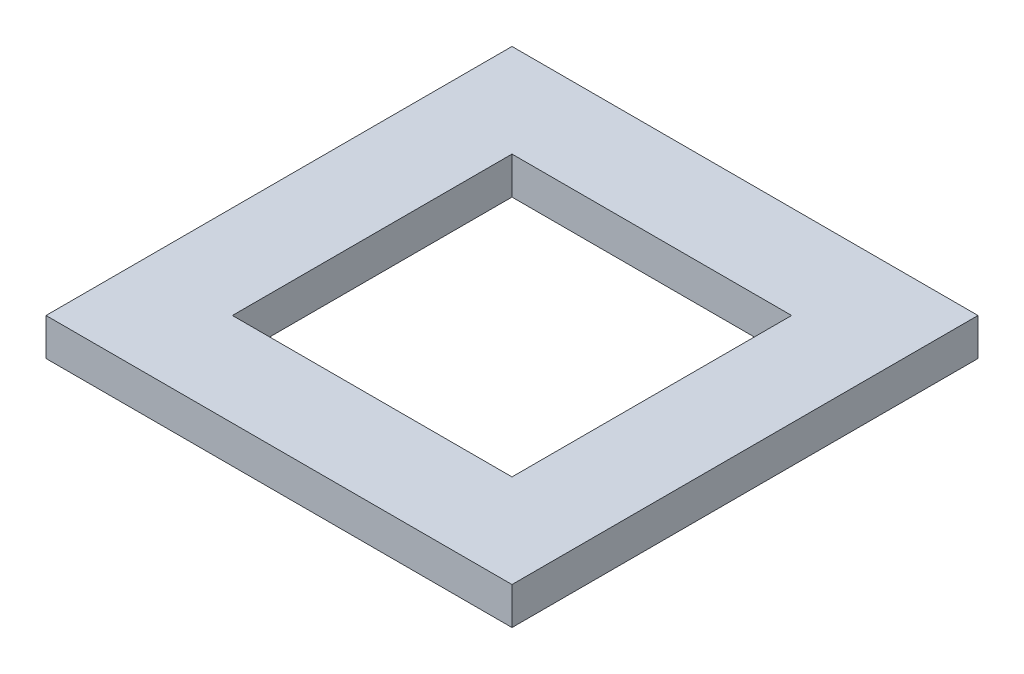
ISO-10303-21;
HEADER;
FILE_DESCRIPTION(('STEP AP214'),'2;1');
FILE_NAME('part.step','',(''),(''),'','','');
FILE_SCHEMA(('AUTOMOTIVE_DESIGN { 1 0 10303 214 1 1 1 1 }'));
ENDSEC;
DATA;
#1=APPLICATION_CONTEXT('core data for automotive mechanical design processes');
#2=APPLICATION_PROTOCOL_DEFINITION('international standard','automotive_design',2000,#1);
#3=PRODUCT_CONTEXT('',#1,'mechanical');
#4=PRODUCT('Part','Part','',(#3));
#5=PRODUCT_RELATED_PRODUCT_CATEGORY('part','',(#4));
#6=PRODUCT_DEFINITION_FORMATION('','',#4);
#7=PRODUCT_DEFINITION_CONTEXT('part definition',#1,'design');
#8=PRODUCT_DEFINITION('design','',#6,#7);
#9=PRODUCT_DEFINITION_SHAPE('','',#8);
#10=(LENGTH_UNIT() NAMED_UNIT(*) SI_UNIT(.MILLI.,.METRE.));
#11=(NAMED_UNIT(*) PLANE_ANGLE_UNIT() SI_UNIT($,.RADIAN.));
#12=(NAMED_UNIT(*) SI_UNIT($,.STERADIAN.) SOLID_ANGLE_UNIT());
#13=UNCERTAINTY_MEASURE_WITH_UNIT(LENGTH_MEASURE(1.E-05),#10,'distance_accuracy_value','');
#14=(GEOMETRIC_REPRESENTATION_CONTEXT(3) GLOBAL_UNCERTAINTY_ASSIGNED_CONTEXT((#13)) GLOBAL_UNIT_ASSIGNED_CONTEXT((#10,
#11,#12)) REPRESENTATION_CONTEXT('',''));
#15=CARTESIAN_POINT('',(0.,0.,0.));
#16=DIRECTION('',(0.,0.,1.));
#17=DIRECTION('',(1.,0.,0.));
#18=AXIS2_PLACEMENT_3D('',#15,#16,#17);
#19=CARTESIAN_POINT('',(0.,2.,0.));
#20=DIRECTION('',(0.,1.,0.));
#21=DIRECTION('',(0.,0.,1.));
#22=AXIS2_PLACEMENT_3D('',#19,#20,#21);
#23=PLANE('',#22);
#24=DIRECTION('',(1.,0.,0.));
#25=VECTOR('',#24,1.);
#26=CARTESIAN_POINT('',(-12.5,2.,12.5));
#27=LINE('',#26,#25);
#28=CARTESIAN_POINT('',(-12.5,2.,12.5));
#29=VERTEX_POINT('',#28);
#30=CARTESIAN_POINT('',(12.5,2.,12.5));
#31=VERTEX_POINT('',#30);
#32=EDGE_CURVE('E153',#29,#31,#27,.T.);
#33=ORIENTED_EDGE('',*,*,#32,.T.);
#34=DIRECTION('',(0.,0.,-1.));
#35=VECTOR('',#34,1.);
#36=CARTESIAN_POINT('',(12.5,2.,12.5));
#37=LINE('',#36,#35);
#38=CARTESIAN_POINT('',(12.5,2.,-12.5));
#39=VERTEX_POINT('',#38);
#40=EDGE_CURVE('E157',#31,#39,#37,.T.);
#41=ORIENTED_EDGE('',*,*,#40,.T.);
#42=DIRECTION('',(-1.,0.,0.));
#43=VECTOR('',#42,1.);
#44=CARTESIAN_POINT('',(-12.5,2.,-12.5));
#45=LINE('',#44,#43);
#46=CARTESIAN_POINT('',(-12.5,2.,-12.5));
#47=VERTEX_POINT('',#46);
#48=EDGE_CURVE('E161',#39,#47,#45,.T.);
#49=ORIENTED_EDGE('',*,*,#48,.T.);
#50=DIRECTION('',(0.,0.,1.));
#51=VECTOR('',#50,1.);
#52=CARTESIAN_POINT('',(-12.5,2.,12.5));
#53=LINE('',#52,#51);
#54=EDGE_CURVE('E164',#47,#29,#53,.T.);
#55=ORIENTED_EDGE('',*,*,#54,.T.);
#56=EDGE_LOOP('',(#33,#41,#49,#55));
#57=FACE_BOUND('',#56,.T.);
#58=DIRECTION('',(0.,0.,-1.));
#59=VECTOR('',#58,1.);
#60=CARTESIAN_POINT('',(7.5,2.,7.5));
#61=LINE('',#60,#59);
#62=CARTESIAN_POINT('',(7.5,2.,7.5));
#63=VERTEX_POINT('',#62);
#64=CARTESIAN_POINT('',(7.5,2.,-7.5));
#65=VERTEX_POINT('',#64);
#66=EDGE_CURVE('E114',#63,#65,#61,.T.);
#67=ORIENTED_EDGE('',*,*,#66,.F.);
#68=DIRECTION('',(1.,0.,0.));
#69=VECTOR('',#68,1.);
#70=CARTESIAN_POINT('',(-7.5,2.,7.5));
#71=LINE('',#70,#69);
#72=CARTESIAN_POINT('',(-7.5,2.,7.5));
#73=VERTEX_POINT('',#72);
#74=EDGE_CURVE('E105',#73,#63,#71,.T.);
#75=ORIENTED_EDGE('',*,*,#74,.F.);
#76=DIRECTION('',(0.,0.,1.));
#77=VECTOR('',#76,1.);
#78=CARTESIAN_POINT('',(-7.5,2.,7.5));
#79=LINE('',#78,#77);
#80=CARTESIAN_POINT('',(-7.5,2.,-7.5));
#81=VERTEX_POINT('',#80);
#82=EDGE_CURVE('E131',#81,#73,#79,.T.);
#83=ORIENTED_EDGE('',*,*,#82,.F.);
#84=DIRECTION('',(-1.,0.,0.));
#85=VECTOR('',#84,1.);
#86=CARTESIAN_POINT('',(-7.5,2.,-7.5));
#87=LINE('',#86,#85);
#88=EDGE_CURVE('E127',#65,#81,#87,.T.);
#89=ORIENTED_EDGE('',*,*,#88,.F.);
#90=EDGE_LOOP('',(#67,#75,#83,#89));
#91=FACE_BOUND('',#90,.T.);
#92=ADVANCED_FACE('F39',(#57,#91),#23,.T.);
#93=CARTESIAN_POINT('',(0.,0.,0.));
#94=DIRECTION('',(0.,1.,0.));
#95=DIRECTION('',(0.,0.,1.));
#96=AXIS2_PLACEMENT_3D('',#93,#94,#95);
#97=PLANE('',#96);
#98=DIRECTION('',(1.,0.,0.));
#99=VECTOR('',#98,1.);
#100=CARTESIAN_POINT('',(-12.5,0.,12.5));
#101=LINE('',#100,#99);
#102=CARTESIAN_POINT('',(-12.5,0.,12.5));
#103=VERTEX_POINT('',#102);
#104=CARTESIAN_POINT('',(12.5,0.,12.5));
#105=VERTEX_POINT('',#104);
#106=EDGE_CURVE('E123',#103,#105,#101,.T.);
#107=ORIENTED_EDGE('',*,*,#106,.F.);
#108=DIRECTION('',(0.,0.,1.));
#109=VECTOR('',#108,1.);
#110=CARTESIAN_POINT('',(-12.5,0.,12.5));
#111=LINE('',#110,#109);
#112=CARTESIAN_POINT('',(-12.5,0.,-12.5));
#113=VERTEX_POINT('',#112);
#114=EDGE_CURVE('E158',#113,#103,#111,.T.);
#115=ORIENTED_EDGE('',*,*,#114,.F.);
#116=DIRECTION('',(-1.,0.,0.));
#117=VECTOR('',#116,1.);
#118=CARTESIAN_POINT('',(-12.5,0.,-12.5));
#119=LINE('',#118,#117);
#120=CARTESIAN_POINT('',(12.5,0.,-12.5));
#121=VERTEX_POINT('',#120);
#122=EDGE_CURVE('E174',#121,#113,#119,.T.);
#123=ORIENTED_EDGE('',*,*,#122,.F.);
#124=DIRECTION('',(0.,0.,-1.));
#125=VECTOR('',#124,1.);
#126=CARTESIAN_POINT('',(12.5,0.,12.5));
#127=LINE('',#126,#125);
#128=EDGE_CURVE('E171',#105,#121,#127,.T.);
#129=ORIENTED_EDGE('',*,*,#128,.F.);
#130=EDGE_LOOP('',(#107,#115,#123,#129));
#131=FACE_BOUND('',#130,.T.);
#132=DIRECTION('',(1.,0.,0.));
#133=VECTOR('',#132,1.);
#134=CARTESIAN_POINT('',(-7.5,0.,7.5));
#135=LINE('',#134,#133);
#136=CARTESIAN_POINT('',(-7.5,0.,7.5));
#137=VERTEX_POINT('',#136);
#138=CARTESIAN_POINT('',(7.5,0.,7.5));
#139=VERTEX_POINT('',#138);
#140=EDGE_CURVE('E63',#137,#139,#135,.T.);
#141=ORIENTED_EDGE('',*,*,#140,.T.);
#142=DIRECTION('',(0.,0.,-1.));
#143=VECTOR('',#142,1.);
#144=CARTESIAN_POINT('',(7.5,0.,7.5));
#145=LINE('',#144,#143);
#146=CARTESIAN_POINT('',(7.5,0.,-7.5));
#147=VERTEX_POINT('',#146);
#148=EDGE_CURVE('E121',#139,#147,#145,.T.);
#149=ORIENTED_EDGE('',*,*,#148,.T.);
#150=DIRECTION('',(-1.,0.,0.));
#151=VECTOR('',#150,1.);
#152=CARTESIAN_POINT('',(-7.5,0.,-7.5));
#153=LINE('',#152,#151);
#154=CARTESIAN_POINT('',(-7.5,0.,-7.5));
#155=VERTEX_POINT('',#154);
#156=EDGE_CURVE('E140',#147,#155,#153,.T.);
#157=ORIENTED_EDGE('',*,*,#156,.T.);
#158=DIRECTION('',(0.,0.,1.));
#159=VECTOR('',#158,1.);
#160=CARTESIAN_POINT('',(-7.5,0.,7.5));
#161=LINE('',#160,#159);
#162=EDGE_CURVE('E115',#155,#137,#161,.T.);
#163=ORIENTED_EDGE('',*,*,#162,.T.);
#164=EDGE_LOOP('',(#141,#149,#157,#163));
#165=FACE_BOUND('',#164,.T.);
#166=ADVANCED_FACE('F197',(#131,#165),#97,.F.);
#167=CARTESIAN_POINT('',(-12.5,2.,12.5));
#168=DIRECTION('',(0.,0.,-1.));
#169=DIRECTION('',(-1.,0.,0.));
#170=AXIS2_PLACEMENT_3D('',#167,#168,#169);
#171=PLANE('',#170);
#172=ORIENTED_EDGE('',*,*,#106,.T.);
#173=DIRECTION('',(0.,-1.,0.));
#174=VECTOR('',#173,1.);
#175=CARTESIAN_POINT('',(12.5,2.,12.5));
#176=LINE('',#175,#174);
#177=EDGE_CURVE('E11',#31,#105,#176,.T.);
#178=ORIENTED_EDGE('',*,*,#177,.F.);
#179=ORIENTED_EDGE('',*,*,#32,.F.);
#180=DIRECTION('',(0.,-1.,0.));
#181=VECTOR('',#180,1.);
#182=CARTESIAN_POINT('',(-12.5,2.,12.5));
#183=LINE('',#182,#181);
#184=EDGE_CURVE('E167',#29,#103,#183,.T.);
#185=ORIENTED_EDGE('',*,*,#184,.T.);
#186=EDGE_LOOP('',(#172,#178,#179,#185));
#187=FACE_BOUND('',#186,.T.);
#188=ADVANCED_FACE('F41',(#187),#171,.F.);
#189=CARTESIAN_POINT('',(12.5,2.,12.5));
#190=DIRECTION('',(-1.,0.,0.));
#191=DIRECTION('',(0.,0.,1.));
#192=AXIS2_PLACEMENT_3D('',#189,#190,#191);
#193=PLANE('',#192);
#194=ORIENTED_EDGE('',*,*,#128,.T.);
#195=DIRECTION('',(0.,-1.,0.));
#196=VECTOR('',#195,1.);
#197=CARTESIAN_POINT('',(12.5,2.,-12.5));
#198=LINE('',#197,#196);
#199=EDGE_CURVE('E48',#39,#121,#198,.T.);
#200=ORIENTED_EDGE('',*,*,#199,.F.);
#201=ORIENTED_EDGE('',*,*,#40,.F.);
#202=ORIENTED_EDGE('',*,*,#177,.T.);
#203=EDGE_LOOP('',(#194,#200,#201,#202));
#204=FACE_BOUND('',#203,.T.);
#205=ADVANCED_FACE('F207',(#204),#193,.F.);
#206=CARTESIAN_POINT('',(-12.5,2.,-12.5));
#207=DIRECTION('',(0.,0.,1.));
#208=DIRECTION('',(1.,0.,0.));
#209=AXIS2_PLACEMENT_3D('',#206,#207,#208);
#210=PLANE('',#209);
#211=ORIENTED_EDGE('',*,*,#122,.T.);
#212=DIRECTION('',(0.,-1.,0.));
#213=VECTOR('',#212,1.);
#214=CARTESIAN_POINT('',(-12.5,2.,-12.5));
#215=LINE('',#214,#213);
#216=EDGE_CURVE('E182',#47,#113,#215,.T.);
#217=ORIENTED_EDGE('',*,*,#216,.F.);
#218=ORIENTED_EDGE('',*,*,#48,.F.);
#219=ORIENTED_EDGE('',*,*,#199,.T.);
#220=EDGE_LOOP('',(#211,#217,#218,#219));
#221=FACE_BOUND('',#220,.T.);
#222=ADVANCED_FACE('F191',(#221),#210,.F.);
#223=CARTESIAN_POINT('',(-12.5,2.,12.5));
#224=DIRECTION('',(1.,0.,0.));
#225=DIRECTION('',(0.,0.,-1.));
#226=AXIS2_PLACEMENT_3D('',#223,#224,#225);
#227=PLANE('',#226);
#228=ORIENTED_EDGE('',*,*,#114,.T.);
#229=ORIENTED_EDGE('',*,*,#184,.F.);
#230=ORIENTED_EDGE('',*,*,#54,.F.);
#231=ORIENTED_EDGE('',*,*,#216,.T.);
#232=EDGE_LOOP('',(#228,#229,#230,#231));
#233=FACE_BOUND('',#232,.T.);
#234=ADVANCED_FACE('F201',(#233),#227,.F.);
#235=CARTESIAN_POINT('',(-7.5,2.,7.5));
#236=DIRECTION('',(0.,0.,-1.));
#237=DIRECTION('',(-1.,0.,0.));
#238=AXIS2_PLACEMENT_3D('',#235,#236,#237);
#239=PLANE('',#238);
#240=ORIENTED_EDGE('',*,*,#140,.F.);
#241=DIRECTION('',(0.,-1.,0.));
#242=VECTOR('',#241,1.);
#243=CARTESIAN_POINT('',(-7.5,2.,7.5));
#244=LINE('',#243,#242);
#245=EDGE_CURVE('E109',#73,#137,#244,.T.);
#246=ORIENTED_EDGE('',*,*,#245,.F.);
#247=ORIENTED_EDGE('',*,*,#74,.T.);
#248=DIRECTION('',(0.,-1.,0.));
#249=VECTOR('',#248,1.);
#250=CARTESIAN_POINT('',(7.5,2.,7.5));
#251=LINE('',#250,#249);
#252=EDGE_CURVE('E108',#63,#139,#251,.T.);
#253=ORIENTED_EDGE('',*,*,#252,.T.);
#254=EDGE_LOOP('',(#240,#246,#247,#253));
#255=FACE_BOUND('',#254,.T.);
#256=ADVANCED_FACE('F107',(#255),#239,.T.);
#257=CARTESIAN_POINT('',(7.5,2.,7.5));
#258=DIRECTION('',(-1.,0.,0.));
#259=DIRECTION('',(0.,0.,1.));
#260=AXIS2_PLACEMENT_3D('',#257,#258,#259);
#261=PLANE('',#260);
#262=ORIENTED_EDGE('',*,*,#148,.F.);
#263=ORIENTED_EDGE('',*,*,#252,.F.);
#264=ORIENTED_EDGE('',*,*,#66,.T.);
#265=DIRECTION('',(0.,-1.,0.));
#266=VECTOR('',#265,1.);
#267=CARTESIAN_POINT('',(7.5,2.,-7.5));
#268=LINE('',#267,#266);
#269=EDGE_CURVE('E124',#65,#147,#268,.T.);
#270=ORIENTED_EDGE('',*,*,#269,.T.);
#271=EDGE_LOOP('',(#262,#263,#264,#270));
#272=FACE_BOUND('',#271,.T.);
#273=ADVANCED_FACE('F118',(#272),#261,.T.);
#274=CARTESIAN_POINT('',(-7.5,2.,-7.5));
#275=DIRECTION('',(0.,0.,1.));
#276=DIRECTION('',(1.,0.,0.));
#277=AXIS2_PLACEMENT_3D('',#274,#275,#276);
#278=PLANE('',#277);
#279=ORIENTED_EDGE('',*,*,#156,.F.);
#280=ORIENTED_EDGE('',*,*,#269,.F.);
#281=ORIENTED_EDGE('',*,*,#88,.T.);
#282=DIRECTION('',(0.,-1.,0.));
#283=VECTOR('',#282,1.);
#284=CARTESIAN_POINT('',(-7.5,2.,-7.5));
#285=LINE('',#284,#283);
#286=EDGE_CURVE('E55',#81,#155,#285,.T.);
#287=ORIENTED_EDGE('',*,*,#286,.T.);
#288=EDGE_LOOP('',(#279,#280,#281,#287));
#289=FACE_BOUND('',#288,.T.);
#290=ADVANCED_FACE('F230',(#289),#278,.T.);
#291=CARTESIAN_POINT('',(-7.5,2.,7.5));
#292=DIRECTION('',(1.,0.,0.));
#293=DIRECTION('',(0.,0.,-1.));
#294=AXIS2_PLACEMENT_3D('',#291,#292,#293);
#295=PLANE('',#294);
#296=ORIENTED_EDGE('',*,*,#162,.F.);
#297=ORIENTED_EDGE('',*,*,#286,.F.);
#298=ORIENTED_EDGE('',*,*,#82,.T.);
#299=ORIENTED_EDGE('',*,*,#245,.T.);
#300=EDGE_LOOP('',(#296,#297,#298,#299));
#301=FACE_BOUND('',#300,.T.);
#302=ADVANCED_FACE('F234',(#301),#295,.T.);
#303=CLOSED_SHELL('',(#92,#166,#188,#205,#222,#234,#256,#273,#290,#302));
#304=MANIFOLD_SOLID_BREP('B2',#303);
#305=ADVANCED_BREP_SHAPE_REPRESENTATION('',(#18,#304),#14);
#306=SHAPE_DEFINITION_REPRESENTATION(#9,#305);
ENDSEC;
END-ISO-10303-21;
